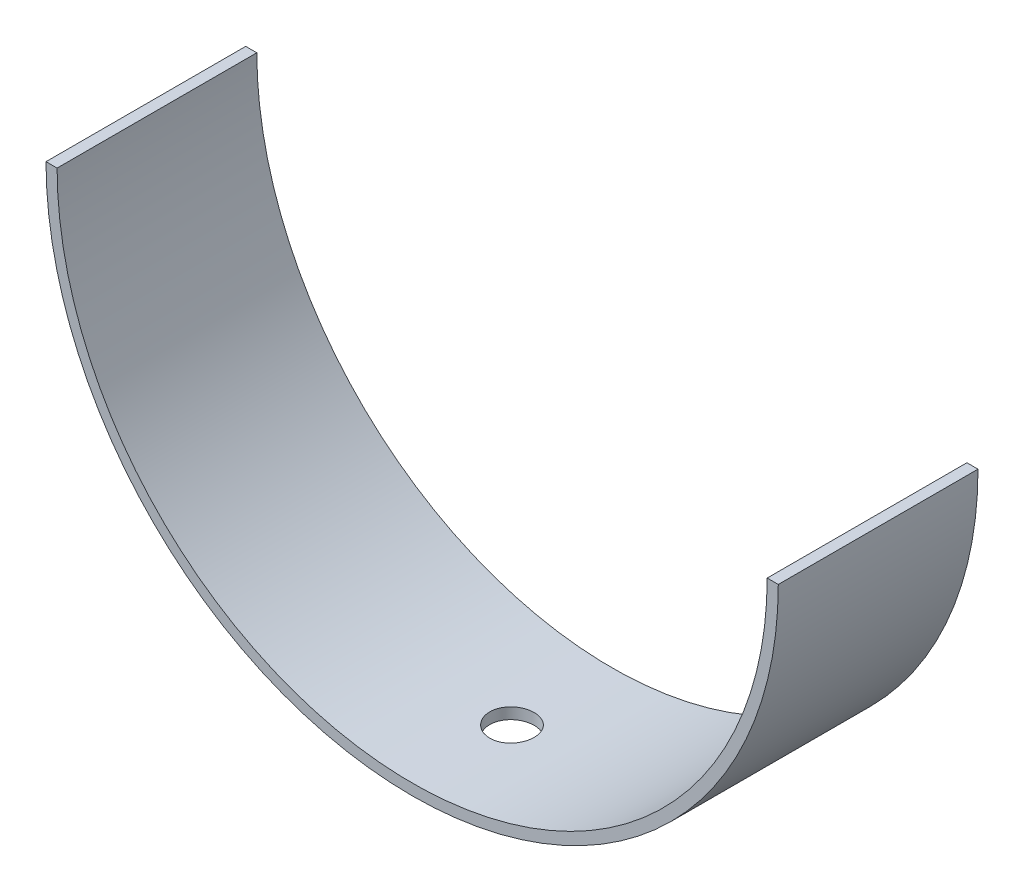
ISO-10303-21;
HEADER;
FILE_DESCRIPTION(('STEP AP214'),'2;1');
FILE_NAME('part.step','',(''),(''),'','','');
FILE_SCHEMA(('AUTOMOTIVE_DESIGN { 1 0 10303 214 1 1 1 1 }'));
ENDSEC;
DATA;
#1=APPLICATION_CONTEXT('core data for automotive mechanical design processes');
#2=APPLICATION_PROTOCOL_DEFINITION('international standard','automotive_design',2000,#1);
#3=PRODUCT_CONTEXT('',#1,'mechanical');
#4=PRODUCT('Part','Part','',(#3));
#5=PRODUCT_RELATED_PRODUCT_CATEGORY('part','',(#4));
#6=PRODUCT_DEFINITION_FORMATION('','',#4);
#7=PRODUCT_DEFINITION_CONTEXT('part definition',#1,'design');
#8=PRODUCT_DEFINITION('design','',#6,#7);
#9=PRODUCT_DEFINITION_SHAPE('','',#8);
#10=(LENGTH_UNIT() NAMED_UNIT(*) SI_UNIT(.MILLI.,.METRE.));
#11=(NAMED_UNIT(*) PLANE_ANGLE_UNIT() SI_UNIT($,.RADIAN.));
#12=(NAMED_UNIT(*) SI_UNIT($,.STERADIAN.) SOLID_ANGLE_UNIT());
#13=UNCERTAINTY_MEASURE_WITH_UNIT(LENGTH_MEASURE(1.E-05),#10,'distance_accuracy_value','');
#14=(GEOMETRIC_REPRESENTATION_CONTEXT(3) GLOBAL_UNCERTAINTY_ASSIGNED_CONTEXT((#13)) GLOBAL_UNIT_ASSIGNED_CONTEXT((#10,
#11,#12)) REPRESENTATION_CONTEXT('',''));
#15=CARTESIAN_POINT('',(0.,0.,0.));
#16=DIRECTION('',(0.,0.,1.));
#17=DIRECTION('',(1.,0.,0.));
#18=AXIS2_PLACEMENT_3D('',#15,#16,#17);
#19=CARTESIAN_POINT('',(0.,0.,9.));
#20=DIRECTION('',(0.,0.,-1.));
#21=DIRECTION('',(-1.,0.,0.));
#22=AXIS2_PLACEMENT_3D('',#19,#20,#21);
#23=CYLINDRICAL_SURFACE('',#22,32.);
#24=CARTESIAN_POINT('',(0.,-32.,-2.));
#25=CARTESIAN_POINT('',(0.112223346836733,-31.9999991691436,-1.99999506217715));
#26=CARTESIAN_POINT('',(0.224525271712999,-31.9994033390944,-1.99052270052992));
#27=CARTESIAN_POINT('',(0.446028210718389,-31.9970837372355,-1.95287153229503));
#28=CARTESIAN_POINT('',(0.555225461224798,-31.995358652637,-1.92467095309709));
#29=CARTESIAN_POINT('',(0.767278508187795,-31.9909756950359,-1.85037649827135));
#30=CARTESIAN_POINT('',(0.870137616661283,-31.9883183141517,-1.80429206138817));
#31=CARTESIAN_POINT('',(1.06663341580873,-31.9823696449571,-1.69555335911499));
#32=CARTESIAN_POINT('',(1.16027221185357,-31.97907850187,-1.63290288851907));
#33=CARTESIAN_POINT('',(1.33583645868493,-31.9722267354338,-1.49270769581982));
#34=CARTESIAN_POINT('',(1.41774628048157,-31.9686657620133,-1.41514341727255));
#35=CARTESIAN_POINT('',(1.56739381033953,-31.9616786657649,-1.2473626650146));
#36=CARTESIAN_POINT('',(1.63513092619535,-31.9582525485769,-1.15714566287376));
#37=CARTESIAN_POINT('',(1.75455837247395,-31.9519188366027,-0.966531917699135));
#38=CARTESIAN_POINT('',(1.80623572151366,-31.9490116620903,-0.866127026123299));
#39=CARTESIAN_POINT('',(1.89199363600726,-31.9440482085556,-0.65804475526381));
#40=CARTESIAN_POINT('',(1.92607439070512,-31.9419919203822,-0.550367454205945));
#41=CARTESIAN_POINT('',(1.97562831743006,-31.9389654609923,-0.330947472138227));
#42=CARTESIAN_POINT('',(1.99112596908517,-31.9379938610264,-0.219210339644777));
#43=CARTESIAN_POINT('',(2.0031493359497,-31.9372420665942,0.0052832782568444));
#44=CARTESIAN_POINT('',(1.99967526602793,-31.9374618586344,0.118039752105779));
#45=CARTESIAN_POINT('',(1.97387412170284,-31.9390667357904,0.341204504819653));
#46=CARTESIAN_POINT('',(1.95157353844043,-31.9404501834944,0.4516158598634));
#47=CARTESIAN_POINT('',(1.88879348852425,-31.9442238871793,0.667124994045574));
#48=CARTESIAN_POINT('',(1.84831391294731,-31.9466141491928,0.772222741342231));
#49=CARTESIAN_POINT('',(1.75029487225468,-31.9521339981319,0.974206420547454));
#50=CARTESIAN_POINT('',(1.6927433900599,-31.9552641055254,1.07108650598473));
#51=CARTESIAN_POINT('',(1.56222292166933,-31.9619103808454,1.25382087056056));
#52=CARTESIAN_POINT('',(1.48925376214585,-31.9654265531119,1.33967502572661));
#53=CARTESIAN_POINT('',(1.32982006299894,-31.9724559793486,1.49807457647715));
#54=CARTESIAN_POINT('',(1.24333259667533,-31.9759692179758,1.57059689836863));
#55=CARTESIAN_POINT('',(1.05939772122562,-31.982591062014,1.70009616014663));
#56=CARTESIAN_POINT('',(0.961950308270385,-31.9856996672838,1.75707309460198));
#57=CARTESIAN_POINT('',(0.75884772275827,-31.9911621980439,1.85386226018084));
#58=CARTESIAN_POINT('',(0.653192132646813,-31.99351608511,1.89367361740615));
#59=CARTESIAN_POINT('',(0.436678621420561,-31.9972034118695,1.95498611546665));
#60=CARTESIAN_POINT('',(0.325820761078037,-31.9985368634802,1.97648747014085));
#61=CARTESIAN_POINT('',(0.102249754998168,-32.0000315242478,2.00054102723564));
#62=CARTESIAN_POINT('',(-0.0104599459167964,-32.0001947068988,2.00312513109352));
#63=CARTESIAN_POINT('',(-0.234711212096934,-31.9993356906232,1.98935418673384));
#64=CARTESIAN_POINT('',(-0.346252783437982,-31.9983134978653,1.97299923707471));
#65=CARTESIAN_POINT('',(-0.564911662206106,-31.9952000745992,1.92184085727314));
#66=CARTESIAN_POINT('',(-0.672032407107901,-31.9931096922732,1.8870520634775));
#67=CARTESIAN_POINT('',(-0.878914962577334,-31.9880950655264,1.80002838810906));
#68=CARTESIAN_POINT('',(-0.97867670694732,-31.9851708136059,1.74779334962248));
#69=CARTESIAN_POINT('',(-1.16815547641269,-31.9788121113869,1.6272787383342));
#70=CARTESIAN_POINT('',(-1.25785892714607,-31.9753769858254,1.55897785943683));
#71=CARTESIAN_POINT('',(-1.42453810642329,-31.9683853852037,1.40830139171274));
#72=CARTESIAN_POINT('',(-1.50151370963649,-31.964828908949,1.32592566430776));
#73=CARTESIAN_POINT('',(-1.64066020097159,-31.9579897332692,1.14930021208164));
#74=CARTESIAN_POINT('',(-1.70281039277817,-31.9547074206804,1.05503416557066));
#75=CARTESIAN_POINT('',(-1.81040027298452,-31.9487928812005,0.857385981252171));
#76=CARTESIAN_POINT('',(-1.85584006443135,-31.9461606503005,0.754003899664865));
#77=CARTESIAN_POINT('',(-1.92868343817412,-31.9418459068394,0.54113387872809));
#78=CARTESIAN_POINT('',(-1.95610004685244,-31.9401627084838,0.431650411420167));
#79=CARTESIAN_POINT('',(-1.99216134169378,-31.9379339446621,0.209623327104219));
#80=CARTESIAN_POINT('',(-2.00080621416728,-31.937388367905,0.0970797404792642));
#81=CARTESIAN_POINT('',(-1.99907684048124,-31.9374966460887,-0.127667083277747));
#82=CARTESIAN_POINT('',(-1.98873513251052,-31.9381484490252,-0.239870573222559));
#83=CARTESIAN_POINT('',(-1.9493936205426,-31.9405736886462,-0.460944612383816));
#84=CARTESIAN_POINT('',(-1.92039378273976,-31.9423471273629,-0.569815155561105));
#85=CARTESIAN_POINT('',(-1.84456652625291,-31.946815285928,-0.781137793918175));
#86=CARTESIAN_POINT('',(-1.79773923559249,-31.9495099991605,-0.883589935184018));
#87=CARTESIAN_POINT('',(-1.68759082343583,-31.9555169893406,-1.07918218089061));
#88=CARTESIAN_POINT('',(-1.62427012917212,-31.9588292502911,-1.17232252645054));
#89=CARTESIAN_POINT('',(-1.48281211963383,-31.9657046929993,-1.34681223237425));
#90=CARTESIAN_POINT('',(-1.40465129170037,-31.9692682672274,-1.42814251505538));
#91=CARTESIAN_POINT('',(-1.23576309808775,-31.976241440984,-1.57655578094688));
#92=CARTESIAN_POINT('',(-1.14503266246552,-31.9796510026267,-1.64363527343915));
#93=CARTESIAN_POINT('',(-0.953477449732046,-31.9859354897034,-1.76169222059213));
#94=CARTESIAN_POINT('',(-0.852640322525283,-31.9888097484528,-1.81264965071681));
#95=CARTESIAN_POINT('',(-0.643897015514734,-31.9936907974328,-1.89684843464142));
#96=CARTESIAN_POINT('',(-0.535999282102359,-31.9956986030929,-1.93011053697395));
#97=CARTESIAN_POINT('',(-0.356201216456015,-31.9980943626532,-1.96932944872111));
#98=CARTESIAN_POINT('',(-0.285463079423697,-31.9988058007412,-1.98081603299553));
#99=CARTESIAN_POINT('',(-0.143160621752724,-31.9997588841249,-1.99615287847334));
#100=CARTESIAN_POINT('',(-0.0715963022564618,-32.0000005300701,-2.00000315023448));
#101=CARTESIAN_POINT('',(0.,-32.,-2.));
#102=B_SPLINE_CURVE_WITH_KNOTS('',3,(#24,#25,#26,#27,#28,#29,#30,#31,#32,#33,#34,#35,#36,#37,
#38,#39,#40,#41,#42,#43,#44,#45,#46,#47,#48,#49,#50,#51,#52,#53,#54,#55,#56,#57,#58,#59,#60,#61,
#62,#63,#64,#65,#66,#67,#68,#69,#70,#71,#72,#73,#74,#75,#76,#77,#78,#79,#80,#81,#82,#83,#84,#85,
#86,#87,#88,#89,#90,#91,#92,#93,#94,#95,#96,#97,#98,#99,#100,#101),.UNSPECIFIED.,.T.,.F.,(4,2,2,
2,2,2,2,2,2,2,2,2,2,2,2,2,2,2,2,2,2,2,2,2,2,2,2,2,2,2,2,2,2,2,2,2,2,2,4),(0.,0.336408671473624,
0.673209123258165,1.00983205968328,1.34637795233539,1.68336820424855,2.02037253446431,
2.35764856671476,2.6949209716279,3.03174859585641,3.36857240527032,3.70492305202053,
4.04127571411158,4.37786570218283,4.71445947444747,5.05163042223775,5.38880148782714,
5.72598971674317,6.06317400764855,6.39978955065089,6.73640334192087,7.07275026373908,
7.40910021078634,7.7458987565046,8.08270061846787,8.41996994064656,8.75723718297114,
9.09426039422936,9.43128026049925,9.76772309914687,10.1041665473784,10.4406075795674,
10.7770398977113,11.1140097747179,11.451062097263,11.7885314296162,12.1256041876343,
12.3402266427971,12.5548488012287),.UNSPECIFIED.);
#103=CARTESIAN_POINT('',(0.,-32.,-2.));
#104=VERTEX_POINT('',#103);
#105=EDGE_CURVE('E109',#104,#104,#102,.T.);
#106=ORIENTED_EDGE('',*,*,#105,.T.);
#107=EDGE_LOOP('',(#106));
#108=FACE_BOUND('',#107,.T.);
#109=CARTESIAN_POINT('',(0.,0.,-9.));
#110=DIRECTION('',(0.,0.,-1.));
#111=DIRECTION('',(1.,0.,0.));
#112=AXIS2_PLACEMENT_3D('',#109,#110,#111);
#113=CIRCLE('',#112,32.);
#114=CARTESIAN_POINT('',(32.,0.,-9.));
#115=VERTEX_POINT('',#114);
#116=CARTESIAN_POINT('',(-32.,0.,-9.));
#117=VERTEX_POINT('',#116);
#118=EDGE_CURVE('E106',#115,#117,#113,.T.);
#119=ORIENTED_EDGE('',*,*,#118,.T.);
#120=DIRECTION('',(0.,0.,-1.));
#121=VECTOR('',#120,1.);
#122=CARTESIAN_POINT('',(-32.,0.,9.));
#123=LINE('',#122,#121);
#124=CARTESIAN_POINT('',(-32.,0.,9.));
#125=VERTEX_POINT('',#124);
#126=EDGE_CURVE('E48',#125,#117,#123,.T.);
#127=ORIENTED_EDGE('',*,*,#126,.F.);
#128=CARTESIAN_POINT('',(0.,0.,9.));
#129=DIRECTION('',(0.,0.,-1.));
#130=DIRECTION('',(1.,0.,0.));
#131=AXIS2_PLACEMENT_3D('',#128,#129,#130);
#132=CIRCLE('',#131,32.);
#133=CARTESIAN_POINT('',(32.,0.,9.));
#134=VERTEX_POINT('',#133);
#135=EDGE_CURVE('E92',#134,#125,#132,.T.);
#136=ORIENTED_EDGE('',*,*,#135,.F.);
#137=DIRECTION('',(0.,0.,-1.));
#138=VECTOR('',#137,1.);
#139=CARTESIAN_POINT('',(32.,0.,9.));
#140=LINE('',#139,#138);
#141=EDGE_CURVE('E102',#134,#115,#140,.T.);
#142=ORIENTED_EDGE('',*,*,#141,.T.);
#143=EDGE_LOOP('',(#119,#127,#136,#142));
#144=FACE_BOUND('',#143,.T.);
#145=ADVANCED_FACE('F34',(#108,#144),#23,.F.);
#146=CARTESIAN_POINT('',(-32.,0.,9.));
#147=DIRECTION('',(0.,-1.,0.));
#148=DIRECTION('',(1.,0.,0.));
#149=AXIS2_PLACEMENT_3D('',#146,#147,#148);
#150=PLANE('',#149);
#151=DIRECTION('',(-1.,0.,0.));
#152=VECTOR('',#151,1.);
#153=CARTESIAN_POINT('',(-32.,0.,-9.));
#154=LINE('',#153,#152);
#155=CARTESIAN_POINT('',(-33.,0.,-9.));
#156=VERTEX_POINT('',#155);
#157=EDGE_CURVE('E97',#117,#156,#154,.T.);
#158=ORIENTED_EDGE('',*,*,#157,.T.);
#159=DIRECTION('',(0.,0.,-1.));
#160=VECTOR('',#159,1.);
#161=CARTESIAN_POINT('',(-33.,0.,9.));
#162=LINE('',#161,#160);
#163=CARTESIAN_POINT('',(-33.,0.,9.));
#164=VERTEX_POINT('',#163);
#165=EDGE_CURVE('E95',#164,#156,#162,.T.);
#166=ORIENTED_EDGE('',*,*,#165,.F.);
#167=DIRECTION('',(-1.,0.,0.));
#168=VECTOR('',#167,1.);
#169=CARTESIAN_POINT('',(-32.,0.,9.));
#170=LINE('',#169,#168);
#171=EDGE_CURVE('E87',#125,#164,#170,.T.);
#172=ORIENTED_EDGE('',*,*,#171,.F.);
#173=ORIENTED_EDGE('',*,*,#126,.T.);
#174=EDGE_LOOP('',(#158,#166,#172,#173));
#175=FACE_BOUND('',#174,.T.);
#176=ADVANCED_FACE('F96',(#175),#150,.F.);
#177=CARTESIAN_POINT('',(0.,0.,9.));
#178=DIRECTION('',(0.,0.,-1.));
#179=DIRECTION('',(-1.,0.,0.));
#180=AXIS2_PLACEMENT_3D('',#177,#178,#179);
#181=CYLINDRICAL_SURFACE('',#180,33.);
#182=CARTESIAN_POINT('',(0.,-33.,-2.));
#183=CARTESIAN_POINT('',(-0.11223035199777,-32.9999991934553,-1.99999505931488));
#184=CARTESIAN_POINT('',(-0.224539454061026,-32.9994213460103,-1.9905215199075));
#185=CARTESIAN_POINT('',(-0.446057029777738,-32.9971717512079,-1.95286540053395));
#186=CARTESIAN_POINT('',(-0.555261732131416,-32.9954987280842,-1.92466100049786));
#187=CARTESIAN_POINT('',(-0.767329718337412,-32.9912480613768,-1.8503558026824));
#188=CARTESIAN_POINT('',(-0.870196295803927,-32.9886708923748,-1.80426439236303));
#189=CARTESIAN_POINT('',(-1.06670556121376,-32.9829018582435,-1.69550862826553));
#190=CARTESIAN_POINT('',(-1.1603503655484,-32.9797101346534,-1.63284808931456));
#191=CARTESIAN_POINT('',(-1.3359175984275,-32.9730657455064,-1.49263527648144));
#192=CARTESIAN_POINT('',(-1.41782525113283,-32.9696127592554,-1.41506451473877));
#193=CARTESIAN_POINT('',(-1.56746682322256,-32.9628377582783,-1.24727115734201));
#194=CARTESIAN_POINT('',(-1.63520015256981,-32.9595157490092,-1.15704803526678));
#195=CARTESIAN_POINT('',(-1.75461530884714,-32.9533748806728,-0.966428158230465));
#196=CARTESIAN_POINT('',(-1.80628495259603,-32.9505564041856,-0.8660237576452));
#197=CARTESIAN_POINT('',(-1.89202804405242,-32.945744561753,-0.657945067110335));
#198=CARTESIAN_POINT('',(-1.92610167173679,-32.9437511873683,-0.550270851531129));
#199=CARTESIAN_POINT('',(-1.97564473971421,-32.9408173770938,-0.330850570432041));
#200=CARTESIAN_POINT('',(-1.99113719981069,-32.9398756384555,-0.219109720269443));
#201=CARTESIAN_POINT('',(-2.00314921463254,-32.939147396657,0.00539018583467464));
#202=CARTESIAN_POINT('',(-1.99966897342668,-32.9393608810714,0.118149230811554));
#203=CARTESIAN_POINT('',(-1.97385349032271,-32.9409178010992,0.341327919340434));
#204=CARTESIAN_POINT('',(-1.95154315250285,-32.942259744241,0.451750455449757));
#205=CARTESIAN_POINT('',(-1.88873940721253,-32.9459199990144,0.667280313362271));
#206=CARTESIAN_POINT('',(-1.84824589610304,-32.9482383162111,0.772387604866243));
#207=CARTESIAN_POINT('',(-1.75019696634516,-32.9535917718125,0.974383407999501));
#208=CARTESIAN_POINT('',(-1.69263024108024,-32.9566273849697,1.07126641829616));
#209=CARTESIAN_POINT('',(-1.56207719157652,-32.9630728535746,1.25400335698044));
#210=CARTESIAN_POINT('',(-1.48909070467601,-32.96648271297,1.33985716900664));
#211=CARTESIAN_POINT('',(-1.32962964114159,-32.9732990244559,1.49824354172845));
#212=CARTESIAN_POINT('',(-1.24313350935619,-32.976705462191,1.57075440341021));
#213=CARTESIAN_POINT('',(-1.05918406072824,-32.9831257520607,1.7002292111132));
#214=CARTESIAN_POINT('',(-0.961730740266484,-32.9861396040656,1.75719315199919));
#215=CARTESIAN_POINT('',(-0.758620173711496,-32.9914353190222,1.85395524328806));
#216=CARTESIAN_POINT('',(-0.652962540238171,-32.9937171473842,1.89375258255941));
#217=CARTESIAN_POINT('',(-0.436448418296833,-32.9972912080356,1.95503732641598));
#218=CARTESIAN_POINT('',(-0.325591986943096,-32.9985834511941,1.97652493210323));
#219=CARTESIAN_POINT('',(-0.102015363053048,-33.0000313221102,2.00055339070938));
#220=CARTESIAN_POINT('',(0.0107015938303813,-33.0001887497391,2.00312424662562));
#221=CARTESIAN_POINT('',(0.234965172819118,-32.9993540353425,1.98932460586641));
#222=CARTESIAN_POINT('',(0.346511800643446,-32.9983618989373,1.97295420179432));
#223=CARTESIAN_POINT('',(0.56518387456149,-32.995340914224,1.92176157762721));
#224=CARTESIAN_POINT('',(0.672312552234767,-32.9933128387463,1.88695311196332));
#225=CARTESIAN_POINT('',(0.879207445516527,-32.988448169123,1.79988641486485));
#226=CARTESIAN_POINT('',(0.978973598822393,-32.9856115681366,1.74762803578756));
#227=CARTESIAN_POINT('',(1.16844890313318,-32.9794441556817,1.62706848655997));
#228=CARTESIAN_POINT('',(1.25814527604758,-32.9761127284743,1.55874726591287));
#229=CARTESIAN_POINT('',(1.42480625984226,-32.969332687145,1.40803062534734));
#230=CARTESIAN_POINT('',(1.50177075262587,-32.9658840719364,1.32563507489453));
#231=CARTESIAN_POINT('',(1.64088476684112,-32.9592531393948,1.14897930048967));
#232=CARTESIAN_POINT('',(1.7030148323598,-32.9560711752942,1.05470374020785));
#233=CARTESIAN_POINT('',(1.81056328121257,-32.9503379884159,0.857041232278708));
#234=CARTESIAN_POINT('',(1.85598176260723,-32.9477867619372,0.753654338099485));
#235=CARTESIAN_POINT('',(1.92878404990719,-32.9436052990299,0.540775169618182));
#236=CARTESIAN_POINT('',(1.95618012745529,-32.9419744360241,0.431287104881723));
#237=CARTESIAN_POINT('',(1.99220002095261,-32.9398158722584,0.20925501212829));
#238=CARTESIAN_POINT('',(2.00082400995716,-32.9392881613288,0.0967110122929257));
#239=CARTESIAN_POINT('',(1.99905326677591,-32.9393956580426,-0.12804475204936));
#240=CARTESIAN_POINT('',(1.98868912504466,-32.9400289952034,-0.240256759741484));
#241=CARTESIAN_POINT('',(1.94929971207175,-32.9423832552306,-0.461344208577993));
#242=CARTESIAN_POINT('',(1.92027440669613,-32.9441041800863,-0.570219643618924));
#243=CARTESIAN_POINT('',(1.8443933805669,-32.9484392254587,-0.781548254928089));
#244=CARTESIAN_POINT('',(1.79753773766592,-32.9510533420755,-0.884001459235444));
#245=CARTESIAN_POINT('',(1.68733044062479,-32.9568801242488,-1.07959060123549));
#246=CARTESIAN_POINT('',(1.62397922680709,-32.9600927738277,-1.17272678753899));
#247=CARTESIAN_POINT('',(1.48246642545597,-32.9667605969994,-1.34719294123392));
#248=CARTESIAN_POINT('',(1.4042828185048,-32.9702161262958,-1.42850503404823));
#249=CARTESIAN_POINT('',(1.2353523513667,-32.9769773406193,-1.57687783170674));
#250=CARTESIAN_POINT('',(1.14460241930322,-32.9802829887445,-1.64393504170897));
#251=CARTESIAN_POINT('',(0.953017395797968,-32.9863751887745,-1.7619409310795));
#252=CARTESIAN_POINT('',(0.852170426334393,-32.9891611179963,-1.81287033777636));
#253=CARTESIAN_POINT('',(0.643413745277129,-32.993891464422,-1.89701214488405));
#254=CARTESIAN_POINT('',(0.535512484838505,-32.9958368680662,-1.9302453242858));
#255=CARTESIAN_POINT('',(0.355791151333995,-32.9981563721137,-1.96940056203418));
#256=CARTESIAN_POINT('',(0.285133187935009,-32.9988446656881,-1.98086054464409));
#257=CARTESIAN_POINT('',(0.142994140412821,-32.9997667363023,-1.99616183280387));
#258=CARTESIAN_POINT('',(0.0715130573534369,-33.0000005139294,-2.00000314819915));
#259=CARTESIAN_POINT('',(0.,-33.,-2.));
#260=B_SPLINE_CURVE_WITH_KNOTS('',3,(#182,#183,#184,#185,#186,#187,#188,#189,#190,#191,#192,
#193,#194,#195,#196,#197,#198,#199,#200,#201,#202,#203,#204,#205,#206,#207,#208,#209,#210,#211,
#212,#213,#214,#215,#216,#217,#218,#219,#220,#221,#222,#223,#224,#225,#226,#227,#228,#229,#230,
#231,#232,#233,#234,#235,#236,#237,#238,#239,#240,#241,#242,#243,#244,#245,#246,#247,#248,#249,
#250,#251,#252,#253,#254,#255,#256,#257,#258,#259),.UNSPECIFIED.,.T.,.F.,(4,2,2,2,2,2,2,2,2,2,2,
2,2,2,2,2,2,2,2,2,2,2,2,2,2,2,2,2,2,2,2,2,2,2,2,2,2,2,4),(0.,0.336429993502574,
0.673252592193046,1.00989865820026,1.34646728319853,1.6834559588458,2.02045865959323,
2.35771633326618,2.6949705573071,3.03180653142981,3.36863888258071,3.70502644694658,
4.04141592865257,4.37802868127014,4.71464498496359,5.05180396517799,5.38896305675778,
5.72613807754826,6.06330939498291,6.39994582480668,6.73658060882986,7.0729646228556,
7.40935148307925,7.74616048983323,8.08297262053984,8.42022409599624,8.75747359248986,
9.0944932139391,9.43150972847309,9.76798377653919,10.1044584400664,10.4409316344607,
10.7773958481707,11.1143635246397,11.4514137197836,11.788865182015,12.1259195285289,
12.3402926288855,12.5546654522126),.UNSPECIFIED.);
#261=CARTESIAN_POINT('',(0.,-33.,-2.));
#262=VERTEX_POINT('',#261);
#263=EDGE_CURVE('E11',#262,#262,#260,.T.);
#264=ORIENTED_EDGE('',*,*,#263,.T.);
#265=EDGE_LOOP('',(#264));
#266=FACE_BOUND('',#265,.T.);
#267=CARTESIAN_POINT('',(0.,0.,-9.));
#268=DIRECTION('',(0.,0.,1.));
#269=DIRECTION('',(1.,0.,0.));
#270=AXIS2_PLACEMENT_3D('',#267,#268,#269);
#271=CIRCLE('',#270,33.);
#272=CARTESIAN_POINT('',(33.,0.,-9.));
#273=VERTEX_POINT('',#272);
#274=EDGE_CURVE('E73',#156,#273,#271,.T.);
#275=ORIENTED_EDGE('',*,*,#274,.T.);
#276=DIRECTION('',(0.,0.,-1.));
#277=VECTOR('',#276,1.);
#278=CARTESIAN_POINT('',(33.,0.,9.));
#279=LINE('',#278,#277);
#280=CARTESIAN_POINT('',(33.,0.,9.));
#281=VERTEX_POINT('',#280);
#282=EDGE_CURVE('E98',#281,#273,#279,.T.);
#283=ORIENTED_EDGE('',*,*,#282,.F.);
#284=CARTESIAN_POINT('',(0.,0.,9.));
#285=DIRECTION('',(0.,0.,1.));
#286=DIRECTION('',(1.,0.,0.));
#287=AXIS2_PLACEMENT_3D('',#284,#285,#286);
#288=CIRCLE('',#287,33.);
#289=EDGE_CURVE('E90',#164,#281,#288,.T.);
#290=ORIENTED_EDGE('',*,*,#289,.F.);
#291=ORIENTED_EDGE('',*,*,#165,.T.);
#292=EDGE_LOOP('',(#275,#283,#290,#291));
#293=FACE_BOUND('',#292,.T.);
#294=ADVANCED_FACE('F100',(#266,#293),#181,.T.);
#295=CARTESIAN_POINT('',(33.,0.,9.));
#296=DIRECTION('',(0.,-1.,0.));
#297=DIRECTION('',(1.,0.,0.));
#298=AXIS2_PLACEMENT_3D('',#295,#296,#297);
#299=PLANE('',#298);
#300=DIRECTION('',(-1.,0.,0.));
#301=VECTOR('',#300,1.);
#302=CARTESIAN_POINT('',(33.,0.,-9.));
#303=LINE('',#302,#301);
#304=EDGE_CURVE('E79',#273,#115,#303,.T.);
#305=ORIENTED_EDGE('',*,*,#304,.T.);
#306=ORIENTED_EDGE('',*,*,#141,.F.);
#307=DIRECTION('',(-1.,0.,0.));
#308=VECTOR('',#307,1.);
#309=CARTESIAN_POINT('',(33.,0.,9.));
#310=LINE('',#309,#308);
#311=EDGE_CURVE('E56',#281,#134,#310,.T.);
#312=ORIENTED_EDGE('',*,*,#311,.F.);
#313=ORIENTED_EDGE('',*,*,#282,.T.);
#314=EDGE_LOOP('',(#305,#306,#312,#313));
#315=FACE_BOUND('',#314,.T.);
#316=ADVANCED_FACE('F126',(#315),#299,.F.);
#317=CARTESIAN_POINT('',(0.,0.,9.));
#318=DIRECTION('',(0.,0.,1.));
#319=DIRECTION('',(1.,0.,0.));
#320=AXIS2_PLACEMENT_3D('',#317,#318,#319);
#321=PLANE('',#320);
#322=ORIENTED_EDGE('',*,*,#135,.T.);
#323=ORIENTED_EDGE('',*,*,#171,.T.);
#324=ORIENTED_EDGE('',*,*,#289,.T.);
#325=ORIENTED_EDGE('',*,*,#311,.T.);
#326=EDGE_LOOP('',(#322,#323,#324,#325));
#327=FACE_BOUND('',#326,.T.);
#328=ADVANCED_FACE('F88',(#327),#321,.T.);
#329=CARTESIAN_POINT('',(0.,0.,-9.));
#330=DIRECTION('',(0.,0.,1.));
#331=DIRECTION('',(1.,0.,0.));
#332=AXIS2_PLACEMENT_3D('',#329,#330,#331);
#333=PLANE('',#332);
#334=ORIENTED_EDGE('',*,*,#118,.F.);
#335=ORIENTED_EDGE('',*,*,#304,.F.);
#336=ORIENTED_EDGE('',*,*,#274,.F.);
#337=ORIENTED_EDGE('',*,*,#157,.F.);
#338=EDGE_LOOP('',(#334,#335,#336,#337));
#339=FACE_BOUND('',#338,.T.);
#340=ADVANCED_FACE('F117',(#339),#333,.F.);
#341=CARTESIAN_POINT('',(0.,-23.,0.));
#342=DIRECTION('',(0.,-1.,0.));
#343=DIRECTION('',(0.,0.,-1.));
#344=AXIS2_PLACEMENT_3D('',#341,#342,#343);
#345=CYLINDRICAL_SURFACE('',#344,2.);
#346=ORIENTED_EDGE('',*,*,#263,.F.);
#347=EDGE_LOOP('',(#346));
#348=FACE_BOUND('',#347,.T.);
#349=ORIENTED_EDGE('',*,*,#105,.F.);
#350=EDGE_LOOP('',(#349));
#351=FACE_BOUND('',#350,.T.);
#352=ADVANCED_FACE('F119',(#348,#351),#345,.F.);
#353=CLOSED_SHELL('',(#145,#176,#294,#316,#328,#340,#352));
#354=MANIFOLD_SOLID_BREP('B2',#353);
#355=ADVANCED_BREP_SHAPE_REPRESENTATION('',(#18,#354),#14);
#356=SHAPE_DEFINITION_REPRESENTATION(#9,#355);
ENDSEC;
END-ISO-10303-21;
